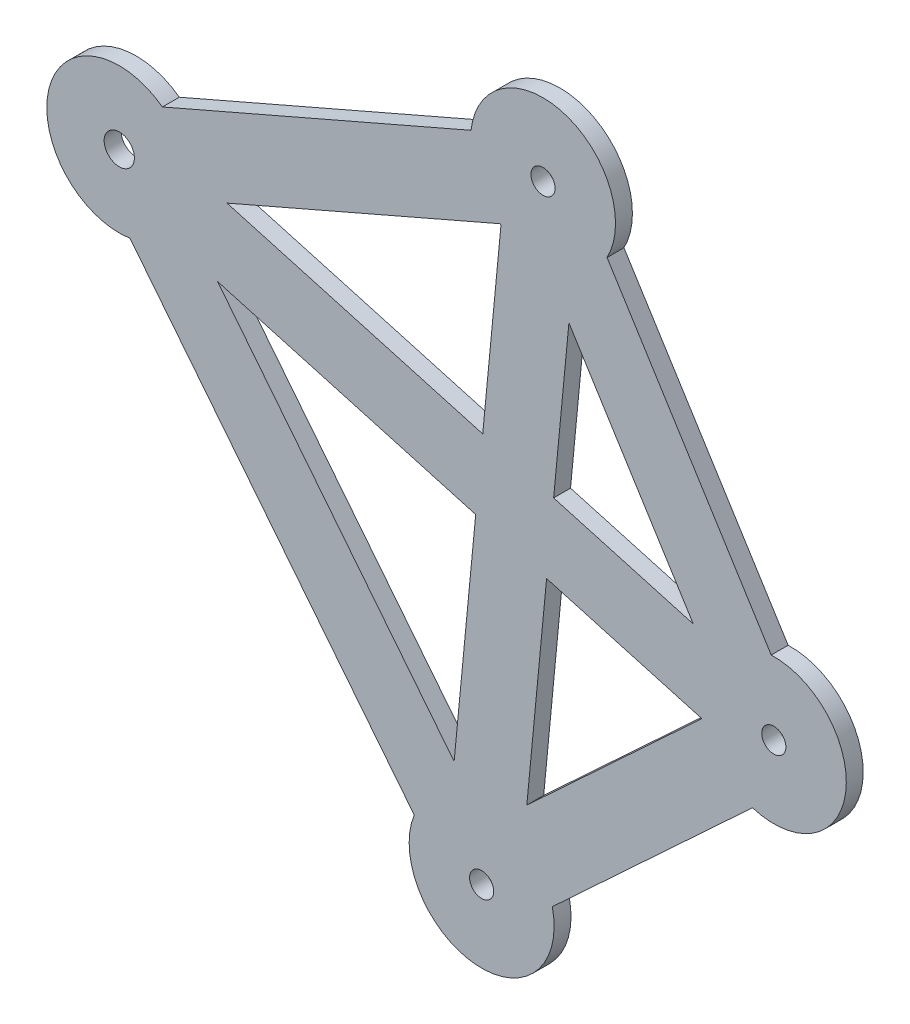
ISO-10303-21;
HEADER;
FILE_DESCRIPTION(('STEP AP214'),'2;1');
FILE_NAME('part.step','',(''),(''),'','','');
FILE_SCHEMA(('AUTOMOTIVE_DESIGN { 1 0 10303 214 1 1 1 1 }'));
ENDSEC;
DATA;
#1=APPLICATION_CONTEXT('core data for automotive mechanical design processes');
#2=APPLICATION_PROTOCOL_DEFINITION('international standard','automotive_design',2000,#1);
#3=PRODUCT_CONTEXT('',#1,'mechanical');
#4=PRODUCT('Part','Part','',(#3));
#5=PRODUCT_RELATED_PRODUCT_CATEGORY('part','',(#4));
#6=PRODUCT_DEFINITION_FORMATION('','',#4);
#7=PRODUCT_DEFINITION_CONTEXT('part definition',#1,'design');
#8=PRODUCT_DEFINITION('design','',#6,#7);
#9=PRODUCT_DEFINITION_SHAPE('','',#8);
#10=(LENGTH_UNIT() NAMED_UNIT(*) SI_UNIT(.MILLI.,.METRE.));
#11=(NAMED_UNIT(*) PLANE_ANGLE_UNIT() SI_UNIT($,.RADIAN.));
#12=(NAMED_UNIT(*) SI_UNIT($,.STERADIAN.) SOLID_ANGLE_UNIT());
#13=UNCERTAINTY_MEASURE_WITH_UNIT(LENGTH_MEASURE(1.E-05),#10,'distance_accuracy_value','');
#14=(GEOMETRIC_REPRESENTATION_CONTEXT(3) GLOBAL_UNCERTAINTY_ASSIGNED_CONTEXT((#13)) GLOBAL_UNIT_ASSIGNED_CONTEXT((#10,
#11,#12)) REPRESENTATION_CONTEXT('',''));
#15=CARTESIAN_POINT('',(0.,0.,0.));
#16=DIRECTION('',(0.,0.,1.));
#17=DIRECTION('',(1.,0.,0.));
#18=AXIS2_PLACEMENT_3D('',#15,#16,#17);
#19=CARTESIAN_POINT('',(0.,0.,4.445));
#20=DIRECTION('',(0.,0.,1.));
#21=DIRECTION('',(1.,0.,0.));
#22=AXIS2_PLACEMENT_3D('',#19,#20,#21);
#23=PLANE('',#22);
#24=DIRECTION('',(-0.0955452014977897,-0.995425092345349,0.));
#25=VECTOR('',#24,1.);
#26=CARTESIAN_POINT('',(139.527981754687,-13.3924985755798,4.445));
#27=LINE('',#26,#25);
#28=CARTESIAN_POINT('',(139.079100318254,-18.0691106744534,4.445));
#29=VERTEX_POINT('',#28);
#30=CARTESIAN_POINT('',(133.8781025695,-72.2550204133151,4.445));
#31=VERTEX_POINT('',#30);
#32=EDGE_CURVE('E303',#29,#31,#27,.T.);
#33=ORIENTED_EDGE('',*,*,#32,.F.);
#34=DIRECTION('',(0.962535090236137,-0.27115715012537,0.));
#35=VECTOR('',#34,1.);
#36=CARTESIAN_POINT('',(5.50995109277635,19.5588472213625,4.445));
#37=LINE('',#36,#35);
#38=CARTESIAN_POINT('',(179.886249098517,-29.5649514809258,4.445));
#39=VERTEX_POINT('',#38);
#40=EDGE_CURVE('E289',#29,#39,#37,.T.);
#41=ORIENTED_EDGE('',*,*,#40,.T.);
#42=DIRECTION('',(-0.733045933523051,-0.680179137687506,0.));
#43=VECTOR('',#42,1.);
#44=CARTESIAN_POINT('',(97.9643927759155,-105.578656820599,4.445));
#45=LINE('',#44,#43);
#46=EDGE_CURVE('E294',#39,#31,#45,.T.);
#47=ORIENTED_EDGE('',*,*,#46,.T.);
#48=EDGE_LOOP('',(#33,#41,#47));
#49=FACE_BOUND('',#48,.T.);
#50=DIRECTION('',(-0.0955452014977897,-0.995425092345349,0.));
#51=VECTOR('',#50,1.);
#52=CARTESIAN_POINT('',(139.527981754687,-13.3924985755798,4.445));
#53=LINE('',#52,#51);
#54=CARTESIAN_POINT('',(144.946705865668,43.0617645795625,4.445));
#55=VERTEX_POINT('',#54);
#56=CARTESIAN_POINT('',(140.928758156241,1.20130579149992,4.445));
#57=VERTEX_POINT('',#56);
#58=EDGE_CURVE('E311',#55,#57,#53,.T.);
#59=ORIENTED_EDGE('',*,*,#58,.F.);
#60=DIRECTION('',(0.530764196849393,-0.847519538030138,0.));
#61=VECTOR('',#60,1.);
#62=CARTESIAN_POINT('',(123.484281559877,77.3327723842063,4.445));
#63=LINE('',#62,#61);
#64=CARTESIAN_POINT('',(177.63853629239,-9.14025881441064,4.445));
#65=VERTEX_POINT('',#64);
#66=EDGE_CURVE('E320',#55,#65,#63,.T.);
#67=ORIENTED_EDGE('',*,*,#66,.T.);
#68=DIRECTION('',(0.962535090236137,-0.27115715012537,0.));
#69=VECTOR('',#68,1.);
#70=CARTESIAN_POINT('',(10.6754948026647,37.8951406903609,4.445));
#71=LINE('',#70,#69);
#72=EDGE_CURVE('E328',#57,#65,#71,.T.);
#73=ORIENTED_EDGE('',*,*,#72,.F.);
#74=EDGE_LOOP('',(#59,#67,#73));
#75=FACE_BOUND('',#74,.T.);
#76=DIRECTION('',(0.622546673894481,-0.78258267219695,0.));
#77=VECTOR('',#76,1.);
#78=CARTESIAN_POINT('',(20.3657159721041,16.2009832192174,4.445));
#79=LINE('',#78,#77);
#80=CARTESIAN_POINT('',(29.5712001303325,4.62907593338059,4.445));
#81=VERTEX_POINT('',#80);
#82=CARTESIAN_POINT('',(104.279919090773,-89.2847643811564,4.445));
#83=VERTEX_POINT('',#82);
#84=EDGE_CURVE('E395',#81,#83,#79,.T.);
#85=ORIENTED_EDGE('',*,*,#84,.T.);
#86=CARTESIAN_POINT('',(122.004659563229,-96.265887155043,4.445));
#87=DIRECTION('',(0.,0.,1.));
#88=DIRECTION('',(1.,0.,0.));
#89=AXIS2_PLACEMENT_3D('',#86,#87,#88);
#90=CIRCLE('',#89,19.05);
#91=CARTESIAN_POINT('',(140.576999280596,-92.0267012163621,4.445));
#92=VERTEX_POINT('',#91);
#93=EDGE_CURVE('E364',#83,#92,#90,.T.);
#94=ORIENTED_EDGE('',*,*,#93,.T.);
#95=DIRECTION('',(-0.733045933523051,-0.680179137687506,0.));
#96=VECTOR('',#95,1.);
#97=CARTESIAN_POINT('',(110.921805348863,-119.543181854213,4.445));
#98=LINE('',#97,#96);
#99=CARTESIAN_POINT('',(193.194620103686,-43.2038289761299,4.445));
#100=VERTEX_POINT('',#99);
#101=EDGE_CURVE('E374',#100,#92,#98,.T.);
#102=ORIENTED_EDGE('',*,*,#101,.F.);
#103=CARTESIAN_POINT('',(198.809547248106,-25.0001180038349,4.445));
#104=DIRECTION('',(0.,0.,1.));
#105=DIRECTION('',(1.,0.,0.));
#106=AXIS2_PLACEMENT_3D('',#103,#104,#105);
#107=CIRCLE('',#106,19.05);
#108=CARTESIAN_POINT('',(198.125737804023,-5.96239480372023,4.445));
#109=VERTEX_POINT('',#108);
#110=EDGE_CURVE('E410',#100,#109,#107,.T.);
#111=ORIENTED_EDGE('',*,*,#110,.T.);
#112=DIRECTION('',(0.530764196849393,-0.847519538030138,0.));
#113=VECTOR('',#112,1.);
#114=CARTESIAN_POINT('',(139.629528759351,87.4438303341872,4.445));
#115=LINE('',#114,#113);
#116=CARTESIAN_POINT('',(154.972256191778,62.9446999428762,4.445));
#117=VERTEX_POINT('',#116);
#118=EDGE_CURVE('E407',#117,#109,#115,.T.);
#119=ORIENTED_EDGE('',*,*,#118,.F.);
#120=CARTESIAN_POINT('',(138.143199548221,71.8713651930099,4.445));
#121=DIRECTION('',(0.,0.,1.));
#122=DIRECTION('',(1.,0.,0.));
#123=AXIS2_PLACEMENT_3D('',#120,#121,#122);
#124=CIRCLE('',#123,19.05);
#125=CARTESIAN_POINT('',(119.216168570783,74.0323830964826,4.445));
#126=VERTEX_POINT('',#125);
#127=EDGE_CURVE('E404',#117,#126,#124,.T.);
#128=ORIENTED_EDGE('',*,*,#127,.T.);
#129=DIRECTION('',(0.917154781963887,0.398531185631406,0.));
#130=VECTOR('',#129,1.);
#131=CARTESIAN_POINT('',(-8.12517138451717,18.6987619997154,4.445));
#132=LINE('',#131,#130);
#133=CARTESIAN_POINT('',(38.0896714543873,38.7804935378964,4.445));
#134=VERTEX_POINT('',#133);
#135=EDGE_CURVE('E401',#134,#126,#132,.T.);
#136=ORIENTED_EDGE('',*,*,#135,.F.);
#137=CARTESIAN_POINT('',(26.7546595632283,23.469712844957,4.445));
#138=DIRECTION('',(0.,0.,1.));
#139=DIRECTION('',(1.,0.,0.));
#140=AXIS2_PLACEMENT_3D('',#137,#138,#139);
#141=CIRCLE('',#140,19.05);
#142=EDGE_CURVE('E398',#134,#81,#141,.T.);
#143=ORIENTED_EDGE('',*,*,#142,.T.);
#144=EDGE_LOOP('',(#85,#94,#102,#111,#119,#128,#136,#143));
#145=FACE_BOUND('',#144,.T.);
#146=CARTESIAN_POINT('',(26.7546595632283,23.469712844957,4.445));
#147=DIRECTION('',(0.,0.,-1.));
#148=DIRECTION('',(-1.,0.,0.));
#149=AXIS2_PLACEMENT_3D('',#146,#147,#148);
#150=CIRCLE('',#149,3.97509999999999);
#151=CARTESIAN_POINT('',(22.7795595632283,23.469712844957,4.445));
#152=VERTEX_POINT('',#151);
#153=EDGE_CURVE('E432',#152,#152,#150,.T.);
#154=ORIENTED_EDGE('',*,*,#153,.T.);
#155=EDGE_LOOP('',(#154));
#156=FACE_BOUND('',#155,.T.);
#157=CARTESIAN_POINT('',(122.004659563229,-96.265887155043,4.445));
#158=DIRECTION('',(0.,0.,-1.));
#159=DIRECTION('',(-1.,0.,0.));
#160=AXIS2_PLACEMENT_3D('',#157,#158,#159);
#161=CIRCLE('',#160,3.175);
#162=CARTESIAN_POINT('',(118.829659563229,-96.265887155043,4.445));
#163=VERTEX_POINT('',#162);
#164=EDGE_CURVE('E438',#163,#163,#161,.T.);
#165=ORIENTED_EDGE('',*,*,#164,.T.);
#166=EDGE_LOOP('',(#165));
#167=FACE_BOUND('',#166,.T.);
#168=CARTESIAN_POINT('',(198.809547248106,-25.0001180038349,4.445));
#169=DIRECTION('',(0.,0.,-1.));
#170=DIRECTION('',(-1.,0.,0.));
#171=AXIS2_PLACEMENT_3D('',#168,#169,#170);
#172=CIRCLE('',#171,3.17499999999997);
#173=CARTESIAN_POINT('',(195.634547248106,-25.0001180038349,4.445));
#174=VERTEX_POINT('',#173);
#175=EDGE_CURVE('E444',#174,#174,#172,.T.);
#176=ORIENTED_EDGE('',*,*,#175,.T.);
#177=EDGE_LOOP('',(#176));
#178=FACE_BOUND('',#177,.T.);
#179=CARTESIAN_POINT('',(138.143199548221,71.8713651930099,4.445));
#180=DIRECTION('',(0.,0.,-1.));
#181=DIRECTION('',(-1.,0.,0.));
#182=AXIS2_PLACEMENT_3D('',#179,#180,#181);
#183=CIRCLE('',#182,3.175);
#184=CARTESIAN_POINT('',(134.968199548221,71.8713651930099,4.445));
#185=VERTEX_POINT('',#184);
#186=EDGE_CURVE('E12',#185,#185,#183,.T.);
#187=ORIENTED_EDGE('',*,*,#186,.T.);
#188=EDGE_LOOP('',(#187));
#189=FACE_BOUND('',#188,.T.);
#190=DIRECTION('',(0.917154781963887,0.398531185631407,0.));
#191=VECTOR('',#190,1.);
#192=CARTESIAN_POINT('',(-0.53315229823887,1.22696340330331,4.445));
#193=LINE('',#192,#191);
#194=CARTESIAN_POINT('',(55.0707041116673,25.3885021713484,4.445));
#195=VERTEX_POINT('',#194);
#196=CARTESIAN_POINT('',(126.808187657062,56.5605845000706,4.445));
#197=VERTEX_POINT('',#196);
#198=EDGE_CURVE('E353',#195,#197,#193,.T.);
#199=ORIENTED_EDGE('',*,*,#198,.T.);
#200=CARTESIAN_POINT('',(138.143199548221,71.8713651930099,4.445));
#201=DIRECTION('',(0.,0.,1.));
#202=DIRECTION('',(1.,0.,0.));
#203=AXIS2_PLACEMENT_3D('',#200,#201,#202);
#204=CIRCLE('',#203,19.05);
#205=CARTESIAN_POINT('',(127.085491452617,56.3591251332242,4.445));
#206=VERTEX_POINT('',#205);
#207=EDGE_CURVE('E335',#197,#206,#204,.T.);
#208=ORIENTED_EDGE('',*,*,#207,.T.);
#209=DIRECTION('',(-0.09554520149779,-0.995425092345349,0.));
#210=VECTOR('',#209,1.);
#211=CARTESIAN_POINT('',(120.565133745508,-11.572362487047,4.445));
#212=LINE('',#211,#210);
#213=CARTESIAN_POINT('',(122.29505864979,6.45063218563913,4.445));
#214=VERTEX_POINT('',#213);
#215=EDGE_CURVE('E343',#206,#214,#212,.T.);
#216=ORIENTED_EDGE('',*,*,#215,.T.);
#217=DIRECTION('',(0.962535090236137,-0.27115715012537,0.));
#218=VECTOR('',#217,1.);
#219=CARTESIAN_POINT('',(10.6754948026647,37.8951406903609,4.445));
#220=LINE('',#219,#218);
#221=EDGE_CURVE('E356',#195,#214,#220,.T.);
#222=ORIENTED_EDGE('',*,*,#221,.F.);
#223=EDGE_LOOP('',(#199,#208,#216,#222));
#224=FACE_BOUND('',#223,.T.);
#225=DIRECTION('',(0.622546673894481,-0.78258267219695,0.));
#226=VECTOR('',#225,1.);
#227=CARTESIAN_POINT('',(35.273915877456,28.0604973569073,4.445));
#228=LINE('',#227,#226);
#229=CARTESIAN_POINT('',(52.5870949526626,6.29667704743447,4.445));
#230=VERTEX_POINT('',#229);
#231=CARTESIAN_POINT('',(114.776579600561,-71.8796511206167,4.445));
#232=VERTEX_POINT('',#231);
#233=EDGE_CURVE('E281',#230,#232,#228,.T.);
#234=ORIENTED_EDGE('',*,*,#233,.F.);
#235=DIRECTION('',(0.962535090236137,-0.27115715012537,0.));
#236=VECTOR('',#235,1.);
#237=CARTESIAN_POINT('',(5.50995109277635,19.5588472213625,4.445));
#238=LINE('',#237,#236);
#239=CARTESIAN_POINT('',(120.445400811803,-12.8197842803142,4.445));
#240=VERTEX_POINT('',#239);
#241=EDGE_CURVE('E137',#230,#240,#238,.T.);
#242=ORIENTED_EDGE('',*,*,#241,.T.);
#243=DIRECTION('',(-0.09554520149779,-0.995425092345349,0.));
#244=VECTOR('',#243,1.);
#245=CARTESIAN_POINT('',(120.565133745508,-11.572362487047,4.445));
#246=LINE('',#245,#244);
#247=EDGE_CURVE('E278',#240,#232,#246,.T.);
#248=ORIENTED_EDGE('',*,*,#247,.T.);
#249=EDGE_LOOP('',(#234,#242,#248));
#250=FACE_BOUND('',#249,.T.);
#251=ADVANCED_FACE('F122',(#49,#75,#145,#156,#167,#178,#189,#224,#250),#23,.T.);
#252=CARTESIAN_POINT('',(0.,0.,0.));
#253=DIRECTION('',(0.,0.,1.));
#254=DIRECTION('',(1.,0.,0.));
#255=AXIS2_PLACEMENT_3D('',#252,#253,#254);
#256=PLANE('',#255);
#257=DIRECTION('',(0.962535090236137,-0.27115715012537,0.));
#258=VECTOR('',#257,1.);
#259=CARTESIAN_POINT('',(5.50995109277635,19.5588472213625,0.));
#260=LINE('',#259,#258);
#261=CARTESIAN_POINT('',(139.079100318254,-18.0691106744534,0.));
#262=VERTEX_POINT('',#261);
#263=CARTESIAN_POINT('',(179.886249098517,-29.5649514809258,0.));
#264=VERTEX_POINT('',#263);
#265=EDGE_CURVE('E291',#262,#264,#260,.T.);
#266=ORIENTED_EDGE('',*,*,#265,.F.);
#267=DIRECTION('',(-0.0955452014977897,-0.995425092345349,0.));
#268=VECTOR('',#267,1.);
#269=CARTESIAN_POINT('',(139.527981754687,-13.3924985755798,0.));
#270=LINE('',#269,#268);
#271=CARTESIAN_POINT('',(133.8781025695,-72.2550204133151,0.));
#272=VERTEX_POINT('',#271);
#273=EDGE_CURVE('E293',#262,#272,#270,.T.);
#274=ORIENTED_EDGE('',*,*,#273,.T.);
#275=DIRECTION('',(-0.733045933523051,-0.680179137687506,0.));
#276=VECTOR('',#275,1.);
#277=CARTESIAN_POINT('',(97.9643927759155,-105.578656820599,0.));
#278=LINE('',#277,#276);
#279=EDGE_CURVE('E297',#264,#272,#278,.T.);
#280=ORIENTED_EDGE('',*,*,#279,.F.);
#281=EDGE_LOOP('',(#266,#274,#280));
#282=FACE_BOUND('',#281,.T.);
#283=DIRECTION('',(0.530764196849393,-0.847519538030138,0.));
#284=VECTOR('',#283,1.);
#285=CARTESIAN_POINT('',(123.484281559877,77.3327723842063,0.));
#286=LINE('',#285,#284);
#287=CARTESIAN_POINT('',(144.946705865668,43.0617645795625,0.));
#288=VERTEX_POINT('',#287);
#289=CARTESIAN_POINT('',(177.63853629239,-9.14025881441064,0.));
#290=VERTEX_POINT('',#289);
#291=EDGE_CURVE('E323',#288,#290,#286,.T.);
#292=ORIENTED_EDGE('',*,*,#291,.F.);
#293=DIRECTION('',(-0.0955452014977897,-0.995425092345349,0.));
#294=VECTOR('',#293,1.);
#295=CARTESIAN_POINT('',(139.527981754687,-13.3924985755798,0.));
#296=LINE('',#295,#294);
#297=CARTESIAN_POINT('',(140.928758156241,1.20130579149991,0.));
#298=VERTEX_POINT('',#297);
#299=EDGE_CURVE('E316',#288,#298,#296,.T.);
#300=ORIENTED_EDGE('',*,*,#299,.T.);
#301=DIRECTION('',(0.962535090236137,-0.27115715012537,0.));
#302=VECTOR('',#301,1.);
#303=CARTESIAN_POINT('',(10.6754948026647,37.8951406903609,0.));
#304=LINE('',#303,#302);
#305=EDGE_CURVE('E319',#298,#290,#304,.T.);
#306=ORIENTED_EDGE('',*,*,#305,.T.);
#307=EDGE_LOOP('',(#292,#300,#306));
#308=FACE_BOUND('',#307,.T.);
#309=CARTESIAN_POINT('',(122.004659563229,-96.265887155043,0.));
#310=DIRECTION('',(0.,0.,1.));
#311=DIRECTION('',(1.,0.,0.));
#312=AXIS2_PLACEMENT_3D('',#309,#310,#311);
#313=CIRCLE('',#312,19.05);
#314=CARTESIAN_POINT('',(104.279919090773,-89.2847643811564,0.));
#315=VERTEX_POINT('',#314);
#316=CARTESIAN_POINT('',(140.576999280596,-92.0267012163621,0.));
#317=VERTEX_POINT('',#316);
#318=EDGE_CURVE('E371',#315,#317,#313,.T.);
#319=ORIENTED_EDGE('',*,*,#318,.F.);
#320=DIRECTION('',(0.622546673894481,-0.78258267219695,0.));
#321=VECTOR('',#320,1.);
#322=CARTESIAN_POINT('',(20.3657159721041,16.2009832192174,0.));
#323=LINE('',#322,#321);
#324=CARTESIAN_POINT('',(29.5712001303325,4.62907593338059,0.));
#325=VERTEX_POINT('',#324);
#326=EDGE_CURVE('E373',#325,#315,#323,.T.);
#327=ORIENTED_EDGE('',*,*,#326,.F.);
#328=CARTESIAN_POINT('',(26.7546595632283,23.469712844957,0.));
#329=DIRECTION('',(0.,0.,1.));
#330=DIRECTION('',(1.,0.,0.));
#331=AXIS2_PLACEMENT_3D('',#328,#329,#330);
#332=CIRCLE('',#331,19.05);
#333=CARTESIAN_POINT('',(38.0896714543873,38.7804935378964,0.));
#334=VERTEX_POINT('',#333);
#335=EDGE_CURVE('E376',#334,#325,#332,.T.);
#336=ORIENTED_EDGE('',*,*,#335,.F.);
#337=DIRECTION('',(0.917154781963887,0.398531185631406,0.));
#338=VECTOR('',#337,1.);
#339=CARTESIAN_POINT('',(-8.12517138451717,18.6987619997154,0.));
#340=LINE('',#339,#338);
#341=CARTESIAN_POINT('',(119.216168570783,74.0323830964826,0.));
#342=VERTEX_POINT('',#341);
#343=EDGE_CURVE('E379',#334,#342,#340,.T.);
#344=ORIENTED_EDGE('',*,*,#343,.T.);
#345=CARTESIAN_POINT('',(138.143199548221,71.8713651930099,0.));
#346=DIRECTION('',(0.,0.,1.));
#347=DIRECTION('',(1.,0.,0.));
#348=AXIS2_PLACEMENT_3D('',#345,#346,#347);
#349=CIRCLE('',#348,19.05);
#350=CARTESIAN_POINT('',(154.972256191778,62.9446999428762,0.));
#351=VERTEX_POINT('',#350);
#352=EDGE_CURVE('E382',#351,#342,#349,.T.);
#353=ORIENTED_EDGE('',*,*,#352,.F.);
#354=DIRECTION('',(0.530764196849393,-0.847519538030138,0.));
#355=VECTOR('',#354,1.);
#356=CARTESIAN_POINT('',(139.629528759351,87.4438303341872,0.));
#357=LINE('',#356,#355);
#358=CARTESIAN_POINT('',(198.125737804023,-5.96239480372023,0.));
#359=VERTEX_POINT('',#358);
#360=EDGE_CURVE('E384',#351,#359,#357,.T.);
#361=ORIENTED_EDGE('',*,*,#360,.T.);
#362=CARTESIAN_POINT('',(198.809547248106,-25.0001180038349,0.));
#363=DIRECTION('',(0.,0.,1.));
#364=DIRECTION('',(1.,0.,0.));
#365=AXIS2_PLACEMENT_3D('',#362,#363,#364);
#366=CIRCLE('',#365,19.05);
#367=CARTESIAN_POINT('',(193.194620103686,-43.2038289761299,0.));
#368=VERTEX_POINT('',#367);
#369=EDGE_CURVE('E387',#368,#359,#366,.T.);
#370=ORIENTED_EDGE('',*,*,#369,.F.);
#371=DIRECTION('',(-0.733045933523051,-0.680179137687506,0.));
#372=VECTOR('',#371,1.);
#373=CARTESIAN_POINT('',(110.921805348863,-119.543181854213,0.));
#374=LINE('',#373,#372);
#375=EDGE_CURVE('E389',#368,#317,#374,.T.);
#376=ORIENTED_EDGE('',*,*,#375,.T.);
#377=EDGE_LOOP('',(#319,#327,#336,#344,#353,#361,#370,#376));
#378=FACE_BOUND('',#377,.T.);
#379=CARTESIAN_POINT('',(26.7546595632283,23.469712844957,0.));
#380=DIRECTION('',(0.,0.,-1.));
#381=DIRECTION('',(-1.,0.,0.));
#382=AXIS2_PLACEMENT_3D('',#379,#380,#381);
#383=CIRCLE('',#382,3.97509999999999);
#384=CARTESIAN_POINT('',(22.7795595632283,23.469712844957,0.));
#385=VERTEX_POINT('',#384);
#386=EDGE_CURVE('E417',#385,#385,#383,.T.);
#387=ORIENTED_EDGE('',*,*,#386,.F.);
#388=EDGE_LOOP('',(#387));
#389=FACE_BOUND('',#388,.T.);
#390=CARTESIAN_POINT('',(122.004659563229,-96.265887155043,0.));
#391=DIRECTION('',(0.,0.,-1.));
#392=DIRECTION('',(-1.,0.,0.));
#393=AXIS2_PLACEMENT_3D('',#390,#391,#392);
#394=CIRCLE('',#393,3.175);
#395=CARTESIAN_POINT('',(118.829659563229,-96.265887155043,0.));
#396=VERTEX_POINT('',#395);
#397=EDGE_CURVE('E435',#396,#396,#394,.T.);
#398=ORIENTED_EDGE('',*,*,#397,.F.);
#399=EDGE_LOOP('',(#398));
#400=FACE_BOUND('',#399,.T.);
#401=CARTESIAN_POINT('',(198.809547248106,-25.0001180038349,0.));
#402=DIRECTION('',(0.,0.,-1.));
#403=DIRECTION('',(-1.,0.,0.));
#404=AXIS2_PLACEMENT_3D('',#401,#402,#403);
#405=CIRCLE('',#404,3.17499999999997);
#406=CARTESIAN_POINT('',(195.634547248106,-25.0001180038349,0.));
#407=VERTEX_POINT('',#406);
#408=EDGE_CURVE('E441',#407,#407,#405,.T.);
#409=ORIENTED_EDGE('',*,*,#408,.F.);
#410=EDGE_LOOP('',(#409));
#411=FACE_BOUND('',#410,.T.);
#412=CARTESIAN_POINT('',(138.143199548221,71.8713651930099,0.));
#413=DIRECTION('',(0.,0.,-1.));
#414=DIRECTION('',(-1.,0.,0.));
#415=AXIS2_PLACEMENT_3D('',#412,#413,#414);
#416=CIRCLE('',#415,3.175);
#417=CARTESIAN_POINT('',(134.968199548221,71.8713651930099,0.));
#418=VERTEX_POINT('',#417);
#419=EDGE_CURVE('E126',#418,#418,#416,.T.);
#420=ORIENTED_EDGE('',*,*,#419,.F.);
#421=EDGE_LOOP('',(#420));
#422=FACE_BOUND('',#421,.T.);
#423=CARTESIAN_POINT('',(138.143199548221,71.8713651930099,0.));
#424=DIRECTION('',(0.,0.,1.));
#425=DIRECTION('',(1.,0.,0.));
#426=AXIS2_PLACEMENT_3D('',#423,#424,#425);
#427=CIRCLE('',#426,19.05);
#428=CARTESIAN_POINT('',(126.808187657062,56.5605845000706,0.));
#429=VERTEX_POINT('',#428);
#430=CARTESIAN_POINT('',(127.085491452617,56.3591251332242,0.));
#431=VERTEX_POINT('',#430);
#432=EDGE_CURVE('E340',#429,#431,#427,.T.);
#433=ORIENTED_EDGE('',*,*,#432,.F.);
#434=DIRECTION('',(0.917154781963887,0.398531185631407,0.));
#435=VECTOR('',#434,1.);
#436=CARTESIAN_POINT('',(-0.53315229823887,1.22696340330331,0.));
#437=LINE('',#436,#435);
#438=CARTESIAN_POINT('',(55.0707041116673,25.3885021713484,0.));
#439=VERTEX_POINT('',#438);
#440=EDGE_CURVE('E342',#439,#429,#437,.T.);
#441=ORIENTED_EDGE('',*,*,#440,.F.);
#442=DIRECTION('',(0.962535090236137,-0.27115715012537,0.));
#443=VECTOR('',#442,1.);
#444=CARTESIAN_POINT('',(10.6754948026647,37.8951406903609,0.));
#445=LINE('',#444,#443);
#446=CARTESIAN_POINT('',(122.29505864979,6.45063218563913,0.));
#447=VERTEX_POINT('',#446);
#448=EDGE_CURVE('E345',#439,#447,#445,.T.);
#449=ORIENTED_EDGE('',*,*,#448,.T.);
#450=DIRECTION('',(-0.09554520149779,-0.995425092345349,0.));
#451=VECTOR('',#450,1.);
#452=CARTESIAN_POINT('',(120.565133745508,-11.572362487047,0.));
#453=LINE('',#452,#451);
#454=EDGE_CURVE('E348',#431,#447,#453,.T.);
#455=ORIENTED_EDGE('',*,*,#454,.F.);
#456=EDGE_LOOP('',(#433,#441,#449,#455));
#457=FACE_BOUND('',#456,.T.);
#458=DIRECTION('',(0.962535090236137,-0.27115715012537,0.));
#459=VECTOR('',#458,1.);
#460=CARTESIAN_POINT('',(5.50995109277635,19.5588472213625,0.));
#461=LINE('',#460,#459);
#462=CARTESIAN_POINT('',(52.5870949526626,6.29667704743447,0.));
#463=VERTEX_POINT('',#462);
#464=CARTESIAN_POINT('',(120.445400811803,-12.8197842803142,0.));
#465=VERTEX_POINT('',#464);
#466=EDGE_CURVE('E267',#463,#465,#461,.T.);
#467=ORIENTED_EDGE('',*,*,#466,.F.);
#468=DIRECTION('',(0.622546673894481,-0.78258267219695,0.));
#469=VECTOR('',#468,1.);
#470=CARTESIAN_POINT('',(35.273915877456,28.0604973569073,0.));
#471=LINE('',#470,#469);
#472=CARTESIAN_POINT('',(114.776579600561,-71.8796511206167,0.));
#473=VERTEX_POINT('',#472);
#474=EDGE_CURVE('E273',#463,#473,#471,.T.);
#475=ORIENTED_EDGE('',*,*,#474,.T.);
#476=DIRECTION('',(-0.09554520149779,-0.995425092345349,0.));
#477=VECTOR('',#476,1.);
#478=CARTESIAN_POINT('',(120.565133745508,-11.572362487047,0.));
#479=LINE('',#478,#477);
#480=EDGE_CURVE('E270',#465,#473,#479,.T.);
#481=ORIENTED_EDGE('',*,*,#480,.F.);
#482=EDGE_LOOP('',(#467,#475,#481));
#483=FACE_BOUND('',#482,.T.);
#484=ADVANCED_FACE('F124',(#282,#308,#378,#389,#400,#411,#422,#457,#483),#256,.F.);
#485=CARTESIAN_POINT('',(138.143199548221,71.8713651930099,4.445));
#486=DIRECTION('',(0.,0.,-1.));
#487=DIRECTION('',(-1.,0.,0.));
#488=AXIS2_PLACEMENT_3D('',#485,#486,#487);
#489=CYLINDRICAL_SURFACE('',#488,3.175);
#490=ORIENTED_EDGE('',*,*,#186,.F.);
#491=EDGE_LOOP('',(#490));
#492=FACE_BOUND('',#491,.T.);
#493=ORIENTED_EDGE('',*,*,#419,.T.);
#494=EDGE_LOOP('',(#493));
#495=FACE_BOUND('',#494,.T.);
#496=ADVANCED_FACE('F454',(#492,#495),#489,.F.);
#497=CARTESIAN_POINT('',(198.809547248106,-25.0001180038349,4.445));
#498=DIRECTION('',(0.,0.,-1.));
#499=DIRECTION('',(-1.,0.,0.));
#500=AXIS2_PLACEMENT_3D('',#497,#498,#499);
#501=CYLINDRICAL_SURFACE('',#500,3.17499999999997);
#502=ORIENTED_EDGE('',*,*,#175,.F.);
#503=EDGE_LOOP('',(#502));
#504=FACE_BOUND('',#503,.T.);
#505=ORIENTED_EDGE('',*,*,#408,.T.);
#506=EDGE_LOOP('',(#505));
#507=FACE_BOUND('',#506,.T.);
#508=ADVANCED_FACE('F450',(#504,#507),#501,.F.);
#509=CARTESIAN_POINT('',(122.004659563229,-96.265887155043,4.445));
#510=DIRECTION('',(0.,0.,-1.));
#511=DIRECTION('',(-1.,0.,0.));
#512=AXIS2_PLACEMENT_3D('',#509,#510,#511);
#513=CYLINDRICAL_SURFACE('',#512,3.175);
#514=ORIENTED_EDGE('',*,*,#164,.F.);
#515=EDGE_LOOP('',(#514));
#516=FACE_BOUND('',#515,.T.);
#517=ORIENTED_EDGE('',*,*,#397,.T.);
#518=EDGE_LOOP('',(#517));
#519=FACE_BOUND('',#518,.T.);
#520=ADVANCED_FACE('F499',(#516,#519),#513,.F.);
#521=CARTESIAN_POINT('',(26.7546595632283,23.469712844957,4.445));
#522=DIRECTION('',(0.,0.,-1.));
#523=DIRECTION('',(-1.,0.,0.));
#524=AXIS2_PLACEMENT_3D('',#521,#522,#523);
#525=CYLINDRICAL_SURFACE('',#524,3.97509999999999);
#526=ORIENTED_EDGE('',*,*,#153,.F.);
#527=EDGE_LOOP('',(#526));
#528=FACE_BOUND('',#527,.T.);
#529=ORIENTED_EDGE('',*,*,#386,.T.);
#530=EDGE_LOOP('',(#529));
#531=FACE_BOUND('',#530,.T.);
#532=ADVANCED_FACE('F503',(#528,#531),#525,.F.);
#533=CARTESIAN_POINT('',(122.004659563229,-96.265887155043,0.));
#534=DIRECTION('',(0.,0.,1.));
#535=DIRECTION('',(1.,0.,0.));
#536=AXIS2_PLACEMENT_3D('',#533,#534,#535);
#537=CYLINDRICAL_SURFACE('',#536,19.05);
#538=ORIENTED_EDGE('',*,*,#93,.F.);
#539=DIRECTION('',(0.,0.,1.));
#540=VECTOR('',#539,1.);
#541=CARTESIAN_POINT('',(104.279919090773,-89.2847643811564,0.));
#542=LINE('',#541,#540);
#543=EDGE_CURVE('E392',#315,#83,#542,.T.);
#544=ORIENTED_EDGE('',*,*,#543,.F.);
#545=ORIENTED_EDGE('',*,*,#318,.T.);
#546=DIRECTION('',(0.,0.,1.));
#547=VECTOR('',#546,1.);
#548=CARTESIAN_POINT('',(140.576999280596,-92.0267012163621,0.));
#549=LINE('',#548,#547);
#550=EDGE_CURVE('E415',#317,#92,#549,.T.);
#551=ORIENTED_EDGE('',*,*,#550,.T.);
#552=EDGE_LOOP('',(#538,#544,#545,#551));
#553=FACE_BOUND('',#552,.T.);
#554=ADVANCED_FACE('F507',(#553),#537,.T.);
#555=CARTESIAN_POINT('',(110.921805348863,-119.543181854213,0.));
#556=DIRECTION('',(-0.680179137687506,0.733045933523051,0.));
#557=DIRECTION('',(-0.733045933523051,-0.680179137687506,0.));
#558=AXIS2_PLACEMENT_3D('',#555,#556,#557);
#559=PLANE('',#558);
#560=ORIENTED_EDGE('',*,*,#101,.T.);
#561=ORIENTED_EDGE('',*,*,#550,.F.);
#562=ORIENTED_EDGE('',*,*,#375,.F.);
#563=DIRECTION('',(0.,0.,1.));
#564=VECTOR('',#563,1.);
#565=CARTESIAN_POINT('',(193.194620103686,-43.2038289761299,0.));
#566=LINE('',#565,#564);
#567=EDGE_CURVE('E418',#368,#100,#566,.T.);
#568=ORIENTED_EDGE('',*,*,#567,.T.);
#569=EDGE_LOOP('',(#560,#561,#562,#568));
#570=FACE_BOUND('',#569,.T.);
#571=ADVANCED_FACE('F511',(#570),#559,.F.);
#572=CARTESIAN_POINT('',(198.809547248106,-25.0001180038349,0.));
#573=DIRECTION('',(0.,0.,1.));
#574=DIRECTION('',(1.,0.,0.));
#575=AXIS2_PLACEMENT_3D('',#572,#573,#574);
#576=CYLINDRICAL_SURFACE('',#575,19.05);
#577=ORIENTED_EDGE('',*,*,#110,.F.);
#578=ORIENTED_EDGE('',*,*,#567,.F.);
#579=ORIENTED_EDGE('',*,*,#369,.T.);
#580=DIRECTION('',(0.,0.,1.));
#581=VECTOR('',#580,1.);
#582=CARTESIAN_POINT('',(198.125737804023,-5.96239480372023,0.));
#583=LINE('',#582,#581);
#584=EDGE_CURVE('E420',#359,#109,#583,.T.);
#585=ORIENTED_EDGE('',*,*,#584,.T.);
#586=EDGE_LOOP('',(#577,#578,#579,#585));
#587=FACE_BOUND('',#586,.T.);
#588=ADVANCED_FACE('F532',(#587),#576,.T.);
#589=CARTESIAN_POINT('',(139.629528759351,87.4438303341872,0.));
#590=DIRECTION('',(-0.847519538030138,-0.530764196849393,0.));
#591=DIRECTION('',(0.530764196849393,-0.847519538030138,0.));
#592=AXIS2_PLACEMENT_3D('',#589,#590,#591);
#593=PLANE('',#592);
#594=ORIENTED_EDGE('',*,*,#118,.T.);
#595=ORIENTED_EDGE('',*,*,#584,.F.);
#596=ORIENTED_EDGE('',*,*,#360,.F.);
#597=DIRECTION('',(0.,0.,1.));
#598=VECTOR('',#597,1.);
#599=CARTESIAN_POINT('',(154.972256191778,62.9446999428762,0.));
#600=LINE('',#599,#598);
#601=EDGE_CURVE('E422',#351,#117,#600,.T.);
#602=ORIENTED_EDGE('',*,*,#601,.T.);
#603=EDGE_LOOP('',(#594,#595,#596,#602));
#604=FACE_BOUND('',#603,.T.);
#605=ADVANCED_FACE('F528',(#604),#593,.F.);
#606=CARTESIAN_POINT('',(138.143199548221,71.8713651930099,0.));
#607=DIRECTION('',(0.,0.,1.));
#608=DIRECTION('',(1.,0.,0.));
#609=AXIS2_PLACEMENT_3D('',#606,#607,#608);
#610=CYLINDRICAL_SURFACE('',#609,19.05);
#611=ORIENTED_EDGE('',*,*,#127,.F.);
#612=ORIENTED_EDGE('',*,*,#601,.F.);
#613=ORIENTED_EDGE('',*,*,#352,.T.);
#614=DIRECTION('',(0.,0.,1.));
#615=VECTOR('',#614,1.);
#616=CARTESIAN_POINT('',(119.216168570783,74.0323830964826,0.));
#617=LINE('',#616,#615);
#618=EDGE_CURVE('E424',#342,#126,#617,.T.);
#619=ORIENTED_EDGE('',*,*,#618,.T.);
#620=EDGE_LOOP('',(#611,#612,#613,#619));
#621=FACE_BOUND('',#620,.T.);
#622=ADVANCED_FACE('F524',(#621),#610,.T.);
#623=CARTESIAN_POINT('',(-8.12517138451717,18.6987619997154,0.));
#624=DIRECTION('',(0.398531185631406,-0.917154781963887,0.));
#625=DIRECTION('',(0.917154781963887,0.398531185631406,0.));
#626=AXIS2_PLACEMENT_3D('',#623,#624,#625);
#627=PLANE('',#626);
#628=ORIENTED_EDGE('',*,*,#135,.T.);
#629=ORIENTED_EDGE('',*,*,#618,.F.);
#630=ORIENTED_EDGE('',*,*,#343,.F.);
#631=DIRECTION('',(0.,0.,1.));
#632=VECTOR('',#631,1.);
#633=CARTESIAN_POINT('',(38.0896714543873,38.7804935378964,0.));
#634=LINE('',#633,#632);
#635=EDGE_CURVE('E426',#334,#134,#634,.T.);
#636=ORIENTED_EDGE('',*,*,#635,.T.);
#637=EDGE_LOOP('',(#628,#629,#630,#636));
#638=FACE_BOUND('',#637,.T.);
#639=ADVANCED_FACE('F520',(#638),#627,.F.);
#640=CARTESIAN_POINT('',(26.7546595632283,23.469712844957,0.));
#641=DIRECTION('',(0.,0.,1.));
#642=DIRECTION('',(1.,0.,0.));
#643=AXIS2_PLACEMENT_3D('',#640,#641,#642);
#644=CYLINDRICAL_SURFACE('',#643,19.05);
#645=ORIENTED_EDGE('',*,*,#142,.F.);
#646=ORIENTED_EDGE('',*,*,#635,.F.);
#647=ORIENTED_EDGE('',*,*,#335,.T.);
#648=DIRECTION('',(0.,0.,1.));
#649=VECTOR('',#648,1.);
#650=CARTESIAN_POINT('',(29.5712001303325,4.62907593338059,0.));
#651=LINE('',#650,#649);
#652=EDGE_CURVE('E428',#325,#81,#651,.T.);
#653=ORIENTED_EDGE('',*,*,#652,.T.);
#654=EDGE_LOOP('',(#645,#646,#647,#653));
#655=FACE_BOUND('',#654,.T.);
#656=ADVANCED_FACE('F516',(#655),#644,.T.);
#657=CARTESIAN_POINT('',(20.3657159721041,16.2009832192174,0.));
#658=DIRECTION('',(-0.78258267219695,-0.622546673894481,0.));
#659=DIRECTION('',(0.622546673894481,-0.78258267219695,0.));
#660=AXIS2_PLACEMENT_3D('',#657,#658,#659);
#661=PLANE('',#660);
#662=ORIENTED_EDGE('',*,*,#84,.F.);
#663=ORIENTED_EDGE('',*,*,#652,.F.);
#664=ORIENTED_EDGE('',*,*,#326,.T.);
#665=ORIENTED_EDGE('',*,*,#543,.T.);
#666=EDGE_LOOP('',(#662,#663,#664,#665));
#667=FACE_BOUND('',#666,.T.);
#668=ADVANCED_FACE('F513',(#667),#661,.T.);
#669=CARTESIAN_POINT('',(138.143199548221,71.8713651930099,0.));
#670=DIRECTION('',(0.,0.,1.));
#671=DIRECTION('',(1.,0.,0.));
#672=AXIS2_PLACEMENT_3D('',#669,#670,#671);
#673=CYLINDRICAL_SURFACE('',#672,19.05);
#674=ORIENTED_EDGE('',*,*,#207,.F.);
#675=DIRECTION('',(0.,0.,1.));
#676=VECTOR('',#675,1.);
#677=CARTESIAN_POINT('',(126.808187657062,56.5605845000706,0.));
#678=LINE('',#677,#676);
#679=EDGE_CURVE('E350',#429,#197,#678,.T.);
#680=ORIENTED_EDGE('',*,*,#679,.F.);
#681=ORIENTED_EDGE('',*,*,#432,.T.);
#682=DIRECTION('',(0.,0.,1.));
#683=VECTOR('',#682,1.);
#684=CARTESIAN_POINT('',(127.085491452617,56.3591251332242,0.));
#685=LINE('',#684,#683);
#686=EDGE_CURVE('E361',#431,#206,#685,.T.);
#687=ORIENTED_EDGE('',*,*,#686,.T.);
#688=EDGE_LOOP('',(#674,#680,#681,#687));
#689=FACE_BOUND('',#688,.T.);
#690=ADVANCED_FACE('F465',(#689),#673,.T.);
#691=CARTESIAN_POINT('',(120.565133745508,-11.572362487047,0.));
#692=DIRECTION('',(-0.995425092345349,0.09554520149779,0.));
#693=DIRECTION('',(-0.09554520149779,-0.995425092345349,0.));
#694=AXIS2_PLACEMENT_3D('',#691,#692,#693);
#695=PLANE('',#694);
#696=ORIENTED_EDGE('',*,*,#215,.F.);
#697=ORIENTED_EDGE('',*,*,#686,.F.);
#698=ORIENTED_EDGE('',*,*,#454,.T.);
#699=DIRECTION('',(0.,0.,1.));
#700=VECTOR('',#699,1.);
#701=CARTESIAN_POINT('',(122.29505864979,6.45063218563913,0.));
#702=LINE('',#701,#700);
#703=EDGE_CURVE('E365',#447,#214,#702,.T.);
#704=ORIENTED_EDGE('',*,*,#703,.T.);
#705=EDGE_LOOP('',(#696,#697,#698,#704));
#706=FACE_BOUND('',#705,.T.);
#707=ADVANCED_FACE('F467',(#706),#695,.T.);
#708=CARTESIAN_POINT('',(10.6754948026647,37.8951406903609,0.));
#709=DIRECTION('',(-0.27115715012537,-0.962535090236136,0.));
#710=DIRECTION('',(0.962535090236137,-0.27115715012537,0.));
#711=AXIS2_PLACEMENT_3D('',#708,#709,#710);
#712=PLANE('',#711);
#713=ORIENTED_EDGE('',*,*,#221,.T.);
#714=ORIENTED_EDGE('',*,*,#703,.F.);
#715=ORIENTED_EDGE('',*,*,#448,.F.);
#716=DIRECTION('',(0.,0.,1.));
#717=VECTOR('',#716,1.);
#718=CARTESIAN_POINT('',(55.0707041116673,25.3885021713484,0.));
#719=LINE('',#718,#717);
#720=EDGE_CURVE('E367',#439,#195,#719,.T.);
#721=ORIENTED_EDGE('',*,*,#720,.T.);
#722=EDGE_LOOP('',(#713,#714,#715,#721));
#723=FACE_BOUND('',#722,.T.);
#724=ADVANCED_FACE('F477',(#723),#712,.F.);
#725=CARTESIAN_POINT('',(-0.53315229823887,1.22696340330331,0.));
#726=DIRECTION('',(0.398531185631407,-0.917154781963887,0.));
#727=DIRECTION('',(0.917154781963887,0.398531185631407,0.));
#728=AXIS2_PLACEMENT_3D('',#725,#726,#727);
#729=PLANE('',#728);
#730=ORIENTED_EDGE('',*,*,#198,.F.);
#731=ORIENTED_EDGE('',*,*,#720,.F.);
#732=ORIENTED_EDGE('',*,*,#440,.T.);
#733=ORIENTED_EDGE('',*,*,#679,.T.);
#734=EDGE_LOOP('',(#730,#731,#732,#733));
#735=FACE_BOUND('',#734,.T.);
#736=ADVANCED_FACE('F474',(#735),#729,.T.);
#737=CARTESIAN_POINT('',(139.527981754687,-13.3924985755798,0.));
#738=DIRECTION('',(-0.995425092345349,0.0955452014977897,0.));
#739=DIRECTION('',(-0.0955452014977897,-0.995425092345349,0.));
#740=AXIS2_PLACEMENT_3D('',#737,#738,#739);
#741=PLANE('',#740);
#742=ORIENTED_EDGE('',*,*,#58,.T.);
#743=DIRECTION('',(0.,0.,1.));
#744=VECTOR('',#743,1.);
#745=CARTESIAN_POINT('',(140.928758156241,1.20130579149991,0.));
#746=LINE('',#745,#744);
#747=EDGE_CURVE('E326',#298,#57,#746,.T.);
#748=ORIENTED_EDGE('',*,*,#747,.F.);
#749=ORIENTED_EDGE('',*,*,#299,.F.);
#750=DIRECTION('',(0.,0.,1.));
#751=VECTOR('',#750,1.);
#752=CARTESIAN_POINT('',(144.946705865668,43.0617645795625,0.));
#753=LINE('',#752,#751);
#754=EDGE_CURVE('E333',#288,#55,#753,.T.);
#755=ORIENTED_EDGE('',*,*,#754,.T.);
#756=EDGE_LOOP('',(#742,#748,#749,#755));
#757=FACE_BOUND('',#756,.T.);
#758=ADVANCED_FACE('F484',(#757),#741,.F.);
#759=CARTESIAN_POINT('',(123.484281559877,77.3327723842063,0.));
#760=DIRECTION('',(-0.847519538030138,-0.530764196849393,0.));
#761=DIRECTION('',(0.530764196849393,-0.847519538030138,0.));
#762=AXIS2_PLACEMENT_3D('',#759,#760,#761);
#763=PLANE('',#762);
#764=ORIENTED_EDGE('',*,*,#66,.F.);
#765=ORIENTED_EDGE('',*,*,#754,.F.);
#766=ORIENTED_EDGE('',*,*,#291,.T.);
#767=DIRECTION('',(0.,0.,1.));
#768=VECTOR('',#767,1.);
#769=CARTESIAN_POINT('',(177.63853629239,-9.14025881441064,0.));
#770=LINE('',#769,#768);
#771=EDGE_CURVE('E336',#290,#65,#770,.T.);
#772=ORIENTED_EDGE('',*,*,#771,.T.);
#773=EDGE_LOOP('',(#764,#765,#766,#772));
#774=FACE_BOUND('',#773,.T.);
#775=ADVANCED_FACE('F568',(#774),#763,.T.);
#776=CARTESIAN_POINT('',(10.6754948026647,37.8951406903609,0.));
#777=DIRECTION('',(-0.27115715012537,-0.962535090236136,0.));
#778=DIRECTION('',(0.962535090236137,-0.27115715012537,0.));
#779=AXIS2_PLACEMENT_3D('',#776,#777,#778);
#780=PLANE('',#779);
#781=ORIENTED_EDGE('',*,*,#72,.T.);
#782=ORIENTED_EDGE('',*,*,#771,.F.);
#783=ORIENTED_EDGE('',*,*,#305,.F.);
#784=ORIENTED_EDGE('',*,*,#747,.T.);
#785=EDGE_LOOP('',(#781,#782,#783,#784));
#786=FACE_BOUND('',#785,.T.);
#787=ADVANCED_FACE('F578',(#786),#780,.F.);
#788=CARTESIAN_POINT('',(5.50995109277635,19.5588472213625,0.));
#789=DIRECTION('',(-0.27115715012537,-0.962535090236136,0.));
#790=DIRECTION('',(0.962535090236137,-0.27115715012537,0.));
#791=AXIS2_PLACEMENT_3D('',#788,#789,#790);
#792=PLANE('',#791);
#793=ORIENTED_EDGE('',*,*,#40,.F.);
#794=DIRECTION('',(0.,0.,1.));
#795=VECTOR('',#794,1.);
#796=CARTESIAN_POINT('',(139.079100318254,-18.0691106744534,0.));
#797=LINE('',#796,#795);
#798=EDGE_CURVE('E300',#262,#29,#797,.T.);
#799=ORIENTED_EDGE('',*,*,#798,.F.);
#800=ORIENTED_EDGE('',*,*,#265,.T.);
#801=DIRECTION('',(0.,0.,1.));
#802=VECTOR('',#801,1.);
#803=CARTESIAN_POINT('',(179.886249098517,-29.5649514809258,0.));
#804=LINE('',#803,#802);
#805=EDGE_CURVE('E308',#264,#39,#804,.T.);
#806=ORIENTED_EDGE('',*,*,#805,.T.);
#807=EDGE_LOOP('',(#793,#799,#800,#806));
#808=FACE_BOUND('',#807,.T.);
#809=ADVANCED_FACE('F588',(#808),#792,.T.);
#810=CARTESIAN_POINT('',(97.9643927759155,-105.578656820599,0.));
#811=DIRECTION('',(-0.680179137687506,0.733045933523051,0.));
#812=DIRECTION('',(-0.733045933523051,-0.680179137687506,0.));
#813=AXIS2_PLACEMENT_3D('',#810,#811,#812);
#814=PLANE('',#813);
#815=ORIENTED_EDGE('',*,*,#46,.F.);
#816=ORIENTED_EDGE('',*,*,#805,.F.);
#817=ORIENTED_EDGE('',*,*,#279,.T.);
#818=DIRECTION('',(0.,0.,1.));
#819=VECTOR('',#818,1.);
#820=CARTESIAN_POINT('',(133.8781025695,-72.2550204133151,0.));
#821=LINE('',#820,#819);
#822=EDGE_CURVE('E312',#272,#31,#821,.T.);
#823=ORIENTED_EDGE('',*,*,#822,.T.);
#824=EDGE_LOOP('',(#815,#816,#817,#823));
#825=FACE_BOUND('',#824,.T.);
#826=ADVANCED_FACE('F598',(#825),#814,.T.);
#827=CARTESIAN_POINT('',(139.527981754687,-13.3924985755798,0.));
#828=DIRECTION('',(-0.995425092345349,0.0955452014977897,0.));
#829=DIRECTION('',(-0.0955452014977897,-0.995425092345349,0.));
#830=AXIS2_PLACEMENT_3D('',#827,#828,#829);
#831=PLANE('',#830);
#832=ORIENTED_EDGE('',*,*,#32,.T.);
#833=ORIENTED_EDGE('',*,*,#822,.F.);
#834=ORIENTED_EDGE('',*,*,#273,.F.);
#835=ORIENTED_EDGE('',*,*,#798,.T.);
#836=EDGE_LOOP('',(#832,#833,#834,#835));
#837=FACE_BOUND('',#836,.T.);
#838=ADVANCED_FACE('F608',(#837),#831,.F.);
#839=CARTESIAN_POINT('',(5.50995109277635,19.5588472213625,0.));
#840=DIRECTION('',(-0.27115715012537,-0.962535090236136,0.));
#841=DIRECTION('',(0.962535090236137,-0.27115715012537,0.));
#842=AXIS2_PLACEMENT_3D('',#839,#840,#841);
#843=PLANE('',#842);
#844=ORIENTED_EDGE('',*,*,#241,.F.);
#845=DIRECTION('',(0.,0.,1.));
#846=VECTOR('',#845,1.);
#847=CARTESIAN_POINT('',(52.5870949526626,6.29667704743447,0.));
#848=LINE('',#847,#846);
#849=EDGE_CURVE('E264',#463,#230,#848,.T.);
#850=ORIENTED_EDGE('',*,*,#849,.F.);
#851=ORIENTED_EDGE('',*,*,#466,.T.);
#852=DIRECTION('',(0.,0.,1.));
#853=VECTOR('',#852,1.);
#854=CARTESIAN_POINT('',(120.445400811803,-12.8197842803142,0.));
#855=LINE('',#854,#853);
#856=EDGE_CURVE('E287',#465,#240,#855,.T.);
#857=ORIENTED_EDGE('',*,*,#856,.T.);
#858=EDGE_LOOP('',(#844,#850,#851,#857));
#859=FACE_BOUND('',#858,.T.);
#860=ADVANCED_FACE('F265',(#859),#843,.T.);
#861=CARTESIAN_POINT('',(120.565133745508,-11.572362487047,0.));
#862=DIRECTION('',(-0.995425092345349,0.09554520149779,0.));
#863=DIRECTION('',(-0.09554520149779,-0.995425092345349,0.));
#864=AXIS2_PLACEMENT_3D('',#861,#862,#863);
#865=PLANE('',#864);
#866=ORIENTED_EDGE('',*,*,#247,.F.);
#867=ORIENTED_EDGE('',*,*,#856,.F.);
#868=ORIENTED_EDGE('',*,*,#480,.T.);
#869=DIRECTION('',(0.,0.,1.));
#870=VECTOR('',#869,1.);
#871=CARTESIAN_POINT('',(114.776579600561,-71.8796511206167,0.));
#872=LINE('',#871,#870);
#873=EDGE_CURVE('E145',#473,#232,#872,.T.);
#874=ORIENTED_EDGE('',*,*,#873,.T.);
#875=EDGE_LOOP('',(#866,#867,#868,#874));
#876=FACE_BOUND('',#875,.T.);
#877=ADVANCED_FACE('F627',(#876),#865,.T.);
#878=CARTESIAN_POINT('',(35.273915877456,28.0604973569073,0.));
#879=DIRECTION('',(-0.78258267219695,-0.622546673894481,0.));
#880=DIRECTION('',(0.622546673894481,-0.78258267219695,0.));
#881=AXIS2_PLACEMENT_3D('',#878,#879,#880);
#882=PLANE('',#881);
#883=ORIENTED_EDGE('',*,*,#233,.T.);
#884=ORIENTED_EDGE('',*,*,#873,.F.);
#885=ORIENTED_EDGE('',*,*,#474,.F.);
#886=ORIENTED_EDGE('',*,*,#849,.T.);
#887=EDGE_LOOP('',(#883,#884,#885,#886));
#888=FACE_BOUND('',#887,.T.);
#889=ADVANCED_FACE('F274',(#888),#882,.F.);
#890=CLOSED_SHELL('',(#251,#484,#496,#508,#520,#532,#554,#571,#588,#605,#622,#639,#656,#668,
#690,#707,#724,#736,#758,#775,#787,#809,#826,#838,#860,#877,#889));
#891=MANIFOLD_SOLID_BREP('B2',#890);
#892=ADVANCED_BREP_SHAPE_REPRESENTATION('',(#18,#891),#14);
#893=SHAPE_DEFINITION_REPRESENTATION(#9,#892);
ENDSEC;
END-ISO-10303-21;
